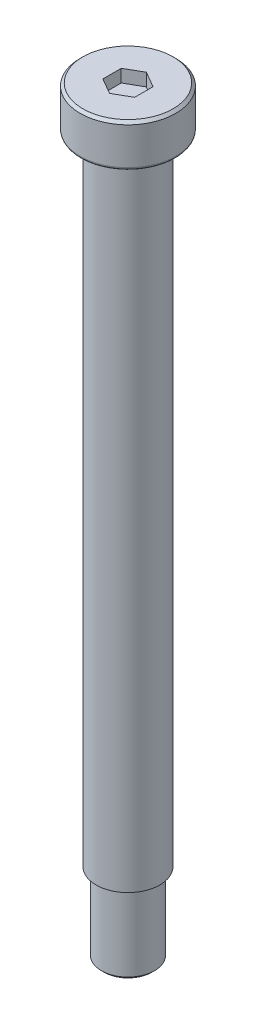
ISO-10303-21;
HEADER;
FILE_DESCRIPTION(('STEP AP214'),'2;1');
FILE_NAME('part.step','',(''),(''),'','','');
FILE_SCHEMA(('AUTOMOTIVE_DESIGN { 1 0 10303 214 1 1 1 1 }'));
ENDSEC;
DATA;
#1=APPLICATION_CONTEXT('core data for automotive mechanical design processes');
#2=APPLICATION_PROTOCOL_DEFINITION('international standard','automotive_design',2000,#1);
#3=PRODUCT_CONTEXT('',#1,'mechanical');
#4=PRODUCT('Part','Part','',(#3));
#5=PRODUCT_RELATED_PRODUCT_CATEGORY('part','',(#4));
#6=PRODUCT_DEFINITION_FORMATION('','',#4);
#7=PRODUCT_DEFINITION_CONTEXT('part definition',#1,'design');
#8=PRODUCT_DEFINITION('design','',#6,#7);
#9=PRODUCT_DEFINITION_SHAPE('','',#8);
#10=(LENGTH_UNIT() NAMED_UNIT(*) SI_UNIT(.MILLI.,.METRE.));
#11=(NAMED_UNIT(*) PLANE_ANGLE_UNIT() SI_UNIT($,.RADIAN.));
#12=(NAMED_UNIT(*) SI_UNIT($,.STERADIAN.) SOLID_ANGLE_UNIT());
#13=UNCERTAINTY_MEASURE_WITH_UNIT(LENGTH_MEASURE(1.E-05),#10,'distance_accuracy_value','');
#14=(GEOMETRIC_REPRESENTATION_CONTEXT(3) GLOBAL_UNCERTAINTY_ASSIGNED_CONTEXT((#13)) GLOBAL_UNIT_ASSIGNED_CONTEXT((#10,
#11,#12)) REPRESENTATION_CONTEXT('',''));
#15=CARTESIAN_POINT('',(0.,0.,0.));
#16=DIRECTION('',(0.,0.,1.));
#17=DIRECTION('',(1.,0.,0.));
#18=AXIS2_PLACEMENT_3D('',#15,#16,#17);
#19=CARTESIAN_POINT('',(0.,0.,0.));
#20=DIRECTION('',(0.,-1.,0.));
#21=DIRECTION('',(1.,0.,0.));
#22=AXIS2_PLACEMENT_3D('',#19,#20,#21);
#23=PLANE('',#22);
#24=CARTESIAN_POINT('',(0.,0.,0.));
#25=DIRECTION('',(0.,-1.,0.));
#26=DIRECTION('',(1.,0.,0.));
#27=AXIS2_PLACEMENT_3D('',#24,#25,#26);
#28=CIRCLE('',#27,8.49999999999999);
#29=CARTESIAN_POINT('',(8.49999999999999,0.,0.));
#30=VERTEX_POINT('',#29);
#31=EDGE_CURVE('E164',#30,#30,#28,.F.);
#32=ORIENTED_EDGE('',*,*,#31,.T.);
#33=EDGE_LOOP('',(#32));
#34=FACE_BOUND('',#33,.T.);
#35=DIRECTION('',(0.866025403784439,0.,-0.5));
#36=VECTOR('',#35,1.);
#37=CARTESIAN_POINT('',(0.,0.,3.46410161513776));
#38=LINE('',#37,#36);
#39=CARTESIAN_POINT('',(0.,0.,3.46410161513776));
#40=VERTEX_POINT('',#39);
#41=CARTESIAN_POINT('',(3.,0.,1.73205080756888));
#42=VERTEX_POINT('',#41);
#43=EDGE_CURVE('E131',#40,#42,#38,.T.);
#44=ORIENTED_EDGE('',*,*,#43,.F.);
#45=DIRECTION('',(0.866025403784439,0.,0.5));
#46=VECTOR('',#45,1.);
#47=CARTESIAN_POINT('',(-3.,0.,1.73205080756888));
#48=LINE('',#47,#46);
#49=CARTESIAN_POINT('',(-3.,0.,1.73205080756888));
#50=VERTEX_POINT('',#49);
#51=EDGE_CURVE('E57',#50,#40,#48,.T.);
#52=ORIENTED_EDGE('',*,*,#51,.F.);
#53=DIRECTION('',(0.,0.,1.));
#54=VECTOR('',#53,1.);
#55=CARTESIAN_POINT('',(-3.,0.,-1.73205080756888));
#56=LINE('',#55,#54);
#57=CARTESIAN_POINT('',(-3.,0.,-1.73205080756888));
#58=VERTEX_POINT('',#57);
#59=EDGE_CURVE('E140',#58,#50,#56,.T.);
#60=ORIENTED_EDGE('',*,*,#59,.F.);
#61=DIRECTION('',(-0.866025403784439,0.,0.5));
#62=VECTOR('',#61,1.);
#63=CARTESIAN_POINT('',(0.,0.,-3.46410161513775));
#64=LINE('',#63,#62);
#65=CARTESIAN_POINT('',(0.,0.,-3.46410161513775));
#66=VERTEX_POINT('',#65);
#67=EDGE_CURVE('E138',#66,#58,#64,.T.);
#68=ORIENTED_EDGE('',*,*,#67,.F.);
#69=DIRECTION('',(-0.866025403784439,0.,-0.5));
#70=VECTOR('',#69,1.);
#71=CARTESIAN_POINT('',(3.,0.,-1.73205080756888));
#72=LINE('',#71,#70);
#73=CARTESIAN_POINT('',(3.,0.,-1.73205080756888));
#74=VERTEX_POINT('',#73);
#75=EDGE_CURVE('E105',#74,#66,#72,.T.);
#76=ORIENTED_EDGE('',*,*,#75,.F.);
#77=DIRECTION('',(0.,0.,-1.));
#78=VECTOR('',#77,1.);
#79=CARTESIAN_POINT('',(3.,0.,1.73205080756888));
#80=LINE('',#79,#78);
#81=EDGE_CURVE('E134',#42,#74,#80,.T.);
#82=ORIENTED_EDGE('',*,*,#81,.F.);
#83=EDGE_LOOP('',(#44,#52,#60,#68,#76,#82));
#84=FACE_BOUND('',#83,.T.);
#85=ADVANCED_FACE('F41',(#34,#84),#23,.F.);
#86=CARTESIAN_POINT('',(0.,5.,0.));
#87=DIRECTION('',(0.,1.,0.));
#88=DIRECTION('',(-1.,0.,0.));
#89=AXIS2_PLACEMENT_3D('',#86,#87,#88);
#90=CYLINDRICAL_SURFACE('',#89,9.);
#91=CARTESIAN_POINT('',(0.,-7.50000000000001,0.));
#92=DIRECTION('',(0.,1.,0.));
#93=DIRECTION('',(-1.,0.,0.));
#94=AXIS2_PLACEMENT_3D('',#91,#92,#93);
#95=CIRCLE('',#94,9.);
#96=CARTESIAN_POINT('',(-9.,-7.50000000000001,0.));
#97=VERTEX_POINT('',#96);
#98=EDGE_CURVE('E170',#97,#97,#95,.T.);
#99=ORIENTED_EDGE('',*,*,#98,.T.);
#100=EDGE_LOOP('',(#99));
#101=FACE_BOUND('',#100,.T.);
#102=CARTESIAN_POINT('',(0.,-0.50000000000001,0.));
#103=DIRECTION('',(0.,-1.,0.));
#104=DIRECTION('',(1.,0.,0.));
#105=AXIS2_PLACEMENT_3D('',#102,#103,#104);
#106=CIRCLE('',#105,9.);
#107=CARTESIAN_POINT('',(9.,-0.500000000000009,0.));
#108=VERTEX_POINT('',#107);
#109=EDGE_CURVE('E167',#108,#108,#106,.T.);
#110=ORIENTED_EDGE('',*,*,#109,.T.);
#111=EDGE_LOOP('',(#110));
#112=FACE_BOUND('',#111,.T.);
#113=ADVANCED_FACE('F192',(#101,#112),#90,.T.);
#114=CARTESIAN_POINT('',(9.,-8.,0.));
#115=DIRECTION('',(0.,1.,0.));
#116=DIRECTION('',(-1.,0.,0.));
#117=AXIS2_PLACEMENT_3D('',#114,#115,#116);
#118=PLANE('',#117);
#119=CARTESIAN_POINT('',(0.,-8.00000000000001,0.));
#120=DIRECTION('',(0.,1.,0.));
#121=DIRECTION('',(-1.,0.,0.));
#122=AXIS2_PLACEMENT_3D('',#119,#120,#121);
#123=CIRCLE('',#122,8.5);
#124=CARTESIAN_POINT('',(-8.49999999999999,-8.00000000000001,0.));
#125=VERTEX_POINT('',#124);
#126=EDGE_CURVE('E173',#125,#125,#123,.F.);
#127=ORIENTED_EDGE('',*,*,#126,.T.);
#128=EDGE_LOOP('',(#127));
#129=FACE_BOUND('',#128,.T.);
#130=CARTESIAN_POINT('',(0.,-8.,0.));
#131=DIRECTION('',(0.,1.,0.));
#132=DIRECTION('',(-1.,0.,0.));
#133=AXIS2_PLACEMENT_3D('',#130,#131,#132);
#134=CIRCLE('',#133,5.75);
#135=CARTESIAN_POINT('',(-5.75,-8.,0.));
#136=VERTEX_POINT('',#135);
#137=EDGE_CURVE('E161',#136,#136,#134,.T.);
#138=ORIENTED_EDGE('',*,*,#137,.T.);
#139=EDGE_LOOP('',(#138));
#140=FACE_BOUND('',#139,.T.);
#141=ADVANCED_FACE('F200',(#129,#140),#118,.F.);
#142=CARTESIAN_POINT('',(0.,5.,0.));
#143=DIRECTION('',(0.,1.,0.));
#144=DIRECTION('',(-1.,0.,0.));
#145=AXIS2_PLACEMENT_3D('',#142,#143,#144);
#146=CYLINDRICAL_SURFACE('',#145,5.75);
#147=ORIENTED_EDGE('',*,*,#137,.F.);
#148=EDGE_LOOP('',(#147));
#149=FACE_BOUND('',#148,.T.);
#150=CARTESIAN_POINT('',(0.,-8.5,0.));
#151=DIRECTION('',(0.,1.,0.));
#152=DIRECTION('',(-1.,0.,0.));
#153=AXIS2_PLACEMENT_3D('',#150,#151,#152);
#154=CIRCLE('',#153,5.75);
#155=CARTESIAN_POINT('',(-5.75,-8.5,0.));
#156=VERTEX_POINT('',#155);
#157=EDGE_CURVE('E158',#156,#156,#154,.T.);
#158=ORIENTED_EDGE('',*,*,#157,.T.);
#159=EDGE_LOOP('',(#158));
#160=FACE_BOUND('',#159,.T.);
#161=ADVANCED_FACE('F254',(#149,#160),#146,.T.);
#162=CARTESIAN_POINT('',(5.75,-8.5,0.));
#163=DIRECTION('',(0.,-1.,0.));
#164=DIRECTION('',(1.,0.,0.));
#165=AXIS2_PLACEMENT_3D('',#162,#163,#164);
#166=PLANE('',#165);
#167=ORIENTED_EDGE('',*,*,#157,.F.);
#168=EDGE_LOOP('',(#167));
#169=FACE_BOUND('',#168,.T.);
#170=CARTESIAN_POINT('',(0.,-8.5,0.));
#171=DIRECTION('',(0.,1.,0.));
#172=DIRECTION('',(-1.,0.,0.));
#173=AXIS2_PLACEMENT_3D('',#170,#171,#172);
#174=CIRCLE('',#173,6.);
#175=CARTESIAN_POINT('',(-6.,-8.5,0.));
#176=VERTEX_POINT('',#175);
#177=EDGE_CURVE('E155',#176,#176,#174,.T.);
#178=ORIENTED_EDGE('',*,*,#177,.T.);
#179=EDGE_LOOP('',(#178));
#180=FACE_BOUND('',#179,.T.);
#181=ADVANCED_FACE('F250',(#169,#180),#166,.F.);
#182=CARTESIAN_POINT('',(0.,5.,0.));
#183=DIRECTION('',(0.,1.,0.));
#184=DIRECTION('',(-1.,0.,0.));
#185=AXIS2_PLACEMENT_3D('',#182,#183,#184);
#186=CYLINDRICAL_SURFACE('',#185,6.00000000000001);
#187=ORIENTED_EDGE('',*,*,#177,.F.);
#188=EDGE_LOOP('',(#187));
#189=FACE_BOUND('',#188,.T.);
#190=CARTESIAN_POINT('',(0.,-128.,0.));
#191=DIRECTION('',(0.,1.,0.));
#192=DIRECTION('',(-1.,0.,0.));
#193=AXIS2_PLACEMENT_3D('',#190,#191,#192);
#194=CIRCLE('',#193,6.00000000000002);
#195=CARTESIAN_POINT('',(-6.,-128.,0.));
#196=VERTEX_POINT('',#195);
#197=EDGE_CURVE('E152',#196,#196,#194,.T.);
#198=ORIENTED_EDGE('',*,*,#197,.T.);
#199=EDGE_LOOP('',(#198));
#200=FACE_BOUND('',#199,.T.);
#201=ADVANCED_FACE('F246',(#189,#200),#186,.T.);
#202=CARTESIAN_POINT('',(6.00000000000004,-128.,0.));
#203=DIRECTION('',(0.,1.,0.));
#204=DIRECTION('',(-1.,0.,0.));
#205=AXIS2_PLACEMENT_3D('',#202,#203,#204);
#206=PLANE('',#205);
#207=ORIENTED_EDGE('',*,*,#197,.F.);
#208=EDGE_LOOP('',(#207));
#209=FACE_BOUND('',#208,.T.);
#210=CARTESIAN_POINT('',(0.,-128.,0.));
#211=DIRECTION('',(0.,1.,0.));
#212=DIRECTION('',(-1.,0.,0.));
#213=AXIS2_PLACEMENT_3D('',#210,#211,#212);
#214=CIRCLE('',#213,5.);
#215=CARTESIAN_POINT('',(-4.99999999999998,-128.,0.));
#216=VERTEX_POINT('',#215);
#217=EDGE_CURVE('E144',#216,#216,#214,.T.);
#218=ORIENTED_EDGE('',*,*,#217,.T.);
#219=EDGE_LOOP('',(#218));
#220=FACE_BOUND('',#219,.T.);
#221=ADVANCED_FACE('F243',(#209,#220),#206,.F.);
#222=CARTESIAN_POINT('',(0.,5.,0.));
#223=DIRECTION('',(0.,1.,0.));
#224=DIRECTION('',(-1.,0.,0.));
#225=AXIS2_PLACEMENT_3D('',#222,#223,#224);
#226=CYLINDRICAL_SURFACE('',#225,5.);
#227=CARTESIAN_POINT('',(0.,-142.5,0.));
#228=DIRECTION('',(0.,1.,0.));
#229=DIRECTION('',(-1.,0.,0.));
#230=AXIS2_PLACEMENT_3D('',#227,#228,#229);
#231=CIRCLE('',#230,5.);
#232=CARTESIAN_POINT('',(-4.99999999999998,-142.5,0.));
#233=VERTEX_POINT('',#232);
#234=EDGE_CURVE('E50',#233,#233,#231,.T.);
#235=ORIENTED_EDGE('',*,*,#234,.T.);
#236=EDGE_LOOP('',(#235));
#237=FACE_BOUND('',#236,.T.);
#238=ORIENTED_EDGE('',*,*,#217,.F.);
#239=EDGE_LOOP('',(#238));
#240=FACE_BOUND('',#239,.T.);
#241=ADVANCED_FACE('F178',(#237,#240),#226,.T.);
#242=CARTESIAN_POINT('',(5.00000000000002,-143.,0.));
#243=DIRECTION('',(0.,1.,0.));
#244=DIRECTION('',(-1.,0.,0.));
#245=AXIS2_PLACEMENT_3D('',#242,#243,#244);
#246=PLANE('',#245);
#247=CARTESIAN_POINT('',(0.,-143.,0.));
#248=DIRECTION('',(0.,1.,0.));
#249=DIRECTION('',(-1.,0.,0.));
#250=AXIS2_PLACEMENT_3D('',#247,#248,#249);
#251=CIRCLE('',#250,4.5);
#252=CARTESIAN_POINT('',(-4.49999999999998,-143.,0.));
#253=VERTEX_POINT('',#252);
#254=EDGE_CURVE('E11',#253,#253,#251,.F.);
#255=ORIENTED_EDGE('',*,*,#254,.T.);
#256=EDGE_LOOP('',(#255));
#257=FACE_BOUND('',#256,.T.);
#258=ADVANCED_FACE('F238',(#257),#246,.F.);
#259=CARTESIAN_POINT('',(-3.,-2.4,1.73205080756888));
#260=DIRECTION('',(-0.5,0.,0.866025403784439));
#261=DIRECTION('',(0.866025403784439,0.,0.5));
#262=AXIS2_PLACEMENT_3D('',#259,#260,#261);
#263=PLANE('',#262);
#264=ORIENTED_EDGE('',*,*,#51,.T.);
#265=DIRECTION('',(0.,1.,0.));
#266=VECTOR('',#265,1.);
#267=CARTESIAN_POINT('',(0.,-2.4,3.46410161513776));
#268=LINE('',#267,#266);
#269=CARTESIAN_POINT('',(0.,-2.4,3.46410161513776));
#270=VERTEX_POINT('',#269);
#271=EDGE_CURVE('E87',#270,#40,#268,.T.);
#272=ORIENTED_EDGE('',*,*,#271,.F.);
#273=DIRECTION('',(0.866025403784439,0.,0.5));
#274=VECTOR('',#273,1.);
#275=CARTESIAN_POINT('',(-3.,-2.4,1.73205080756888));
#276=LINE('',#275,#274);
#277=CARTESIAN_POINT('',(-3.,-2.4,1.73205080756888));
#278=VERTEX_POINT('',#277);
#279=EDGE_CURVE('E142',#278,#270,#276,.T.);
#280=ORIENTED_EDGE('',*,*,#279,.F.);
#281=DIRECTION('',(0.,1.,0.));
#282=VECTOR('',#281,1.);
#283=CARTESIAN_POINT('',(-3.,-2.4,1.73205080756888));
#284=LINE('',#283,#282);
#285=EDGE_CURVE('E65',#278,#50,#284,.T.);
#286=ORIENTED_EDGE('',*,*,#285,.T.);
#287=EDGE_LOOP('',(#264,#272,#280,#286));
#288=FACE_BOUND('',#287,.T.);
#289=ADVANCED_FACE('F228',(#288),#263,.F.);
#290=CARTESIAN_POINT('',(-3.,-2.4,-1.73205080756888));
#291=DIRECTION('',(-1.,0.,0.));
#292=DIRECTION('',(0.,-1.,0.));
#293=AXIS2_PLACEMENT_3D('',#290,#291,#292);
#294=PLANE('',#293);
#295=ORIENTED_EDGE('',*,*,#59,.T.);
#296=ORIENTED_EDGE('',*,*,#285,.F.);
#297=DIRECTION('',(0.,0.,1.));
#298=VECTOR('',#297,1.);
#299=CARTESIAN_POINT('',(-3.,-2.4,-1.73205080756888));
#300=LINE('',#299,#298);
#301=CARTESIAN_POINT('',(-3.,-2.4,-1.73205080756888));
#302=VERTEX_POINT('',#301);
#303=EDGE_CURVE('E117',#302,#278,#300,.T.);
#304=ORIENTED_EDGE('',*,*,#303,.F.);
#305=DIRECTION('',(0.,1.,0.));
#306=VECTOR('',#305,1.);
#307=CARTESIAN_POINT('',(-3.,-2.4,-1.73205080756888));
#308=LINE('',#307,#306);
#309=EDGE_CURVE('E109',#302,#58,#308,.T.);
#310=ORIENTED_EDGE('',*,*,#309,.T.);
#311=EDGE_LOOP('',(#295,#296,#304,#310));
#312=FACE_BOUND('',#311,.T.);
#313=ADVANCED_FACE('F225',(#312),#294,.F.);
#314=CARTESIAN_POINT('',(0.,-2.4,-3.46410161513775));
#315=DIRECTION('',(-0.5,0.,-0.866025403784439));
#316=DIRECTION('',(-0.866025403784439,0.,0.5));
#317=AXIS2_PLACEMENT_3D('',#314,#315,#316);
#318=PLANE('',#317);
#319=ORIENTED_EDGE('',*,*,#67,.T.);
#320=ORIENTED_EDGE('',*,*,#309,.F.);
#321=DIRECTION('',(-0.866025403784439,0.,0.5));
#322=VECTOR('',#321,1.);
#323=CARTESIAN_POINT('',(0.,-2.4,-3.46410161513775));
#324=LINE('',#323,#322);
#325=CARTESIAN_POINT('',(0.,-2.4,-3.46410161513775));
#326=VERTEX_POINT('',#325);
#327=EDGE_CURVE('E113',#326,#302,#324,.T.);
#328=ORIENTED_EDGE('',*,*,#327,.F.);
#329=DIRECTION('',(0.,1.,0.));
#330=VECTOR('',#329,1.);
#331=CARTESIAN_POINT('',(0.,-2.4,-3.46410161513775));
#332=LINE('',#331,#330);
#333=EDGE_CURVE('E98',#326,#66,#332,.T.);
#334=ORIENTED_EDGE('',*,*,#333,.T.);
#335=EDGE_LOOP('',(#319,#320,#328,#334));
#336=FACE_BOUND('',#335,.T.);
#337=ADVANCED_FACE('F114',(#336),#318,.F.);
#338=CARTESIAN_POINT('',(3.,-2.4,-1.73205080756888));
#339=DIRECTION('',(0.5,0.,-0.866025403784439));
#340=DIRECTION('',(-0.866025403784439,0.,-0.5));
#341=AXIS2_PLACEMENT_3D('',#338,#339,#340);
#342=PLANE('',#341);
#343=ORIENTED_EDGE('',*,*,#75,.T.);
#344=ORIENTED_EDGE('',*,*,#333,.F.);
#345=DIRECTION('',(-0.866025403784439,0.,-0.5));
#346=VECTOR('',#345,1.);
#347=CARTESIAN_POINT('',(3.,-2.4,-1.73205080756888));
#348=LINE('',#347,#346);
#349=CARTESIAN_POINT('',(3.,-2.4,-1.73205080756888));
#350=VERTEX_POINT('',#349);
#351=EDGE_CURVE('E102',#350,#326,#348,.T.);
#352=ORIENTED_EDGE('',*,*,#351,.F.);
#353=DIRECTION('',(0.,1.,0.));
#354=VECTOR('',#353,1.);
#355=CARTESIAN_POINT('',(3.,-2.4,-1.73205080756888));
#356=LINE('',#355,#354);
#357=EDGE_CURVE('E110',#350,#74,#356,.T.);
#358=ORIENTED_EDGE('',*,*,#357,.T.);
#359=EDGE_LOOP('',(#343,#344,#352,#358));
#360=FACE_BOUND('',#359,.T.);
#361=ADVANCED_FACE('F100',(#360),#342,.F.);
#362=CARTESIAN_POINT('',(3.,-2.4,1.73205080756888));
#363=DIRECTION('',(1.,0.,0.));
#364=DIRECTION('',(0.,0.,-1.));
#365=AXIS2_PLACEMENT_3D('',#362,#363,#364);
#366=PLANE('',#365);
#367=ORIENTED_EDGE('',*,*,#81,.T.);
#368=ORIENTED_EDGE('',*,*,#357,.F.);
#369=DIRECTION('',(0.,0.,-1.));
#370=VECTOR('',#369,1.);
#371=CARTESIAN_POINT('',(3.,-2.4,1.73205080756888));
#372=LINE('',#371,#370);
#373=CARTESIAN_POINT('',(3.,-2.4,1.73205080756888));
#374=VERTEX_POINT('',#373);
#375=EDGE_CURVE('E123',#374,#350,#372,.T.);
#376=ORIENTED_EDGE('',*,*,#375,.F.);
#377=DIRECTION('',(0.,1.,0.));
#378=VECTOR('',#377,1.);
#379=CARTESIAN_POINT('',(3.,-2.4,1.73205080756888));
#380=LINE('',#379,#378);
#381=EDGE_CURVE('E147',#374,#42,#380,.T.);
#382=ORIENTED_EDGE('',*,*,#381,.T.);
#383=EDGE_LOOP('',(#367,#368,#376,#382));
#384=FACE_BOUND('',#383,.T.);
#385=ADVANCED_FACE('F221',(#384),#366,.F.);
#386=CARTESIAN_POINT('',(0.,-2.4,3.46410161513776));
#387=DIRECTION('',(0.5,0.,0.866025403784439));
#388=DIRECTION('',(0.866025403784439,0.,-0.5));
#389=AXIS2_PLACEMENT_3D('',#386,#387,#388);
#390=PLANE('',#389);
#391=ORIENTED_EDGE('',*,*,#43,.T.);
#392=ORIENTED_EDGE('',*,*,#381,.F.);
#393=DIRECTION('',(0.866025403784439,0.,-0.5));
#394=VECTOR('',#393,1.);
#395=CARTESIAN_POINT('',(0.,-2.4,3.46410161513776));
#396=LINE('',#395,#394);
#397=EDGE_CURVE('E125',#270,#374,#396,.T.);
#398=ORIENTED_EDGE('',*,*,#397,.F.);
#399=ORIENTED_EDGE('',*,*,#271,.T.);
#400=EDGE_LOOP('',(#391,#392,#398,#399));
#401=FACE_BOUND('',#400,.T.);
#402=ADVANCED_FACE('F212',(#401),#390,.F.);
#403=CARTESIAN_POINT('',(0.,-2.4,0.));
#404=DIRECTION('',(0.,1.,0.));
#405=DIRECTION('',(-1.,0.,0.));
#406=AXIS2_PLACEMENT_3D('',#403,#404,#405);
#407=PLANE('',#406);
#408=ORIENTED_EDGE('',*,*,#279,.T.);
#409=ORIENTED_EDGE('',*,*,#397,.T.);
#410=ORIENTED_EDGE('',*,*,#375,.T.);
#411=ORIENTED_EDGE('',*,*,#351,.T.);
#412=ORIENTED_EDGE('',*,*,#327,.T.);
#413=ORIENTED_EDGE('',*,*,#303,.T.);
#414=EDGE_LOOP('',(#408,#409,#410,#411,#412,#413));
#415=FACE_BOUND('',#414,.T.);
#416=ADVANCED_FACE('F120',(#415),#407,.T.);
#417=CARTESIAN_POINT('',(0.,0.,0.));
#418=DIRECTION('',(0.,-1.,0.));
#419=DIRECTION('',(1.,0.,0.));
#420=AXIS2_PLACEMENT_3D('',#417,#418,#419);
#421=CONICAL_SURFACE('',#420,8.49999999999999,0.785398163397447);
#422=ORIENTED_EDGE('',*,*,#109,.F.);
#423=EDGE_LOOP('',(#422));
#424=FACE_BOUND('',#423,.T.);
#425=ORIENTED_EDGE('',*,*,#31,.F.);
#426=EDGE_LOOP('',(#425));
#427=FACE_BOUND('',#426,.T.);
#428=ADVANCED_FACE('F188',(#424,#427),#421,.T.);
#429=CARTESIAN_POINT('',(0.,-7.50000000000001,0.));
#430=DIRECTION('',(0.,1.,0.));
#431=DIRECTION('',(-1.,0.,0.));
#432=AXIS2_PLACEMENT_3D('',#429,#430,#431);
#433=TOROIDAL_SURFACE('',#432,8.5,0.5);
#434=ORIENTED_EDGE('',*,*,#126,.F.);
#435=EDGE_LOOP('',(#434));
#436=FACE_BOUND('',#435,.T.);
#437=ORIENTED_EDGE('',*,*,#98,.F.);
#438=EDGE_LOOP('',(#437));
#439=FACE_BOUND('',#438,.T.);
#440=ADVANCED_FACE('F182',(#436,#439),#433,.T.);
#441=CARTESIAN_POINT('',(0.,-142.5,0.));
#442=DIRECTION('',(0.,1.,0.));
#443=DIRECTION('',(-1.,0.,0.));
#444=AXIS2_PLACEMENT_3D('',#441,#442,#443);
#445=CONICAL_SURFACE('',#444,5.,0.785398163397419);
#446=ORIENTED_EDGE('',*,*,#254,.F.);
#447=EDGE_LOOP('',(#446));
#448=FACE_BOUND('',#447,.T.);
#449=ORIENTED_EDGE('',*,*,#234,.F.);
#450=EDGE_LOOP('',(#449));
#451=FACE_BOUND('',#450,.T.);
#452=ADVANCED_FACE('F44',(#448,#451),#445,.T.);
#453=CLOSED_SHELL('',(#85,#113,#141,#161,#181,#201,#221,#241,#258,#289,#313,#337,#361,#385,#402,
#416,#428,#440,#452));
#454=MANIFOLD_SOLID_BREP('B2',#453);
#455=ADVANCED_BREP_SHAPE_REPRESENTATION('',(#18,#454),#14);
#456=SHAPE_DEFINITION_REPRESENTATION(#9,#455);
ENDSEC;
END-ISO-10303-21;
